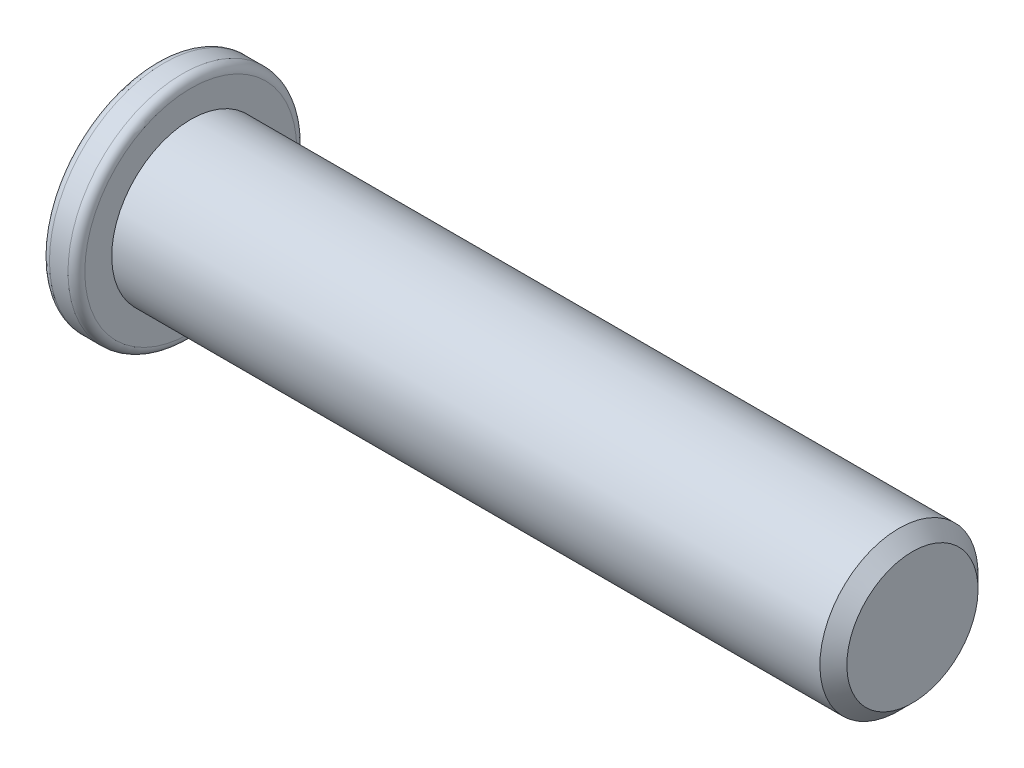
ISO-10303-21;
HEADER;
FILE_DESCRIPTION(('STEP AP214'),'2;1');
FILE_NAME('part.step','',(''),(''),'','','');
FILE_SCHEMA(('AUTOMOTIVE_DESIGN { 1 0 10303 214 1 1 1 1 }'));
ENDSEC;
DATA;
#1=APPLICATION_CONTEXT('core data for automotive mechanical design processes');
#2=APPLICATION_PROTOCOL_DEFINITION('international standard','automotive_design',2000,#1);
#3=PRODUCT_CONTEXT('',#1,'mechanical');
#4=PRODUCT('Part','Part','',(#3));
#5=PRODUCT_RELATED_PRODUCT_CATEGORY('part','',(#4));
#6=PRODUCT_DEFINITION_FORMATION('','',#4);
#7=PRODUCT_DEFINITION_CONTEXT('part definition',#1,'design');
#8=PRODUCT_DEFINITION('design','',#6,#7);
#9=PRODUCT_DEFINITION_SHAPE('','',#8);
#10=(LENGTH_UNIT() NAMED_UNIT(*) SI_UNIT(.MILLI.,.METRE.));
#11=(NAMED_UNIT(*) PLANE_ANGLE_UNIT() SI_UNIT($,.RADIAN.));
#12=(NAMED_UNIT(*) SI_UNIT($,.STERADIAN.) SOLID_ANGLE_UNIT());
#13=UNCERTAINTY_MEASURE_WITH_UNIT(LENGTH_MEASURE(1.E-05),#10,'distance_accuracy_value','');
#14=(GEOMETRIC_REPRESENTATION_CONTEXT(3) GLOBAL_UNCERTAINTY_ASSIGNED_CONTEXT((#13)) GLOBAL_UNIT_ASSIGNED_CONTEXT((#10,
#11,#12)) REPRESENTATION_CONTEXT('',''));
#15=CARTESIAN_POINT('',(0.,0.,0.));
#16=DIRECTION('',(0.,0.,1.));
#17=DIRECTION('',(1.,0.,0.));
#18=AXIS2_PLACEMENT_3D('',#15,#16,#17);
#19=CARTESIAN_POINT('',(0.,0.,0.));
#20=DIRECTION('',(-1.,0.,0.));
#21=DIRECTION('',(0.,-1.,0.));
#22=AXIS2_PLACEMENT_3D('',#19,#20,#21);
#23=PLANE('',#22);
#24=CARTESIAN_POINT('',(0.,0.,0.));
#25=DIRECTION('',(-1.,0.,0.));
#26=DIRECTION('',(0.,-1.,0.));
#27=AXIS2_PLACEMENT_3D('',#24,#25,#26);
#28=CIRCLE('',#27,6.3);
#29=CARTESIAN_POINT('',(0.,-6.3,0.));
#30=VERTEX_POINT('',#29);
#31=EDGE_CURVE('E48',#30,#30,#28,.T.);
#32=ORIENTED_EDGE('',*,*,#31,.T.);
#33=EDGE_LOOP('',(#32));
#34=FACE_BOUND('',#33,.T.);
#35=ADVANCED_FACE('F37',(#34),#23,.T.);
#36=CARTESIAN_POINT('',(45.,0.,0.));
#37=DIRECTION('',(1.,0.,0.));
#38=DIRECTION('',(0.,1.,0.));
#39=AXIS2_PLACEMENT_3D('',#36,#37,#38);
#40=CYLINDRICAL_SURFACE('',#39,6.8);
#41=CARTESIAN_POINT('',(1.6,0.,0.));
#42=DIRECTION('',(1.,0.,0.));
#43=DIRECTION('',(0.,1.,0.));
#44=AXIS2_PLACEMENT_3D('',#41,#42,#43);
#45=CIRCLE('',#44,6.8);
#46=CARTESIAN_POINT('',(1.60000000000001,6.8,0.));
#47=VERTEX_POINT('',#46);
#48=EDGE_CURVE('E52',#47,#47,#45,.F.);
#49=ORIENTED_EDGE('',*,*,#48,.T.);
#50=EDGE_LOOP('',(#49));
#51=FACE_BOUND('',#50,.T.);
#52=CARTESIAN_POINT('',(0.5,0.,0.));
#53=DIRECTION('',(-1.,0.,0.));
#54=DIRECTION('',(0.,-1.,0.));
#55=AXIS2_PLACEMENT_3D('',#52,#53,#54);
#56=CIRCLE('',#55,6.8);
#57=CARTESIAN_POINT('',(0.499999999999998,-6.8,0.));
#58=VERTEX_POINT('',#57);
#59=EDGE_CURVE('E57',#58,#58,#56,.F.);
#60=ORIENTED_EDGE('',*,*,#59,.T.);
#61=EDGE_LOOP('',(#60));
#62=FACE_BOUND('',#61,.T.);
#63=ADVANCED_FACE('F71',(#51,#62),#40,.T.);
#64=CARTESIAN_POINT('',(2.1,6.8,0.));
#65=DIRECTION('',(1.,0.,0.));
#66=DIRECTION('',(0.,1.,0.));
#67=AXIS2_PLACEMENT_3D('',#64,#65,#66);
#68=PLANE('',#67);
#69=CARTESIAN_POINT('',(2.1,0.,0.));
#70=DIRECTION('',(1.,0.,0.));
#71=DIRECTION('',(0.,1.,0.));
#72=AXIS2_PLACEMENT_3D('',#69,#70,#71);
#73=CIRCLE('',#72,6.3);
#74=CARTESIAN_POINT('',(2.1,6.3,0.));
#75=VERTEX_POINT('',#74);
#76=EDGE_CURVE('E60',#75,#75,#73,.T.);
#77=ORIENTED_EDGE('',*,*,#76,.T.);
#78=EDGE_LOOP('',(#77));
#79=FACE_BOUND('',#78,.T.);
#80=CARTESIAN_POINT('',(2.1,0.,0.));
#81=DIRECTION('',(1.,0.,0.));
#82=DIRECTION('',(0.,1.,0.));
#83=AXIS2_PLACEMENT_3D('',#80,#81,#82);
#84=CIRCLE('',#83,4.7);
#85=CARTESIAN_POINT('',(2.10000000000001,4.7,0.));
#86=VERTEX_POINT('',#85);
#87=EDGE_CURVE('E63',#86,#86,#84,.T.);
#88=ORIENTED_EDGE('',*,*,#87,.F.);
#89=EDGE_LOOP('',(#88));
#90=FACE_BOUND('',#89,.T.);
#91=ADVANCED_FACE('F69',(#79,#90),#68,.T.);
#92=CARTESIAN_POINT('',(45.,0.,0.));
#93=DIRECTION('',(1.,0.,0.));
#94=DIRECTION('',(0.,1.,0.));
#95=AXIS2_PLACEMENT_3D('',#92,#93,#94);
#96=CYLINDRICAL_SURFACE('',#95,4.70000000000001);
#97=CARTESIAN_POINT('',(44.2,0.,0.));
#98=DIRECTION('',(1.,0.,0.));
#99=DIRECTION('',(0.,1.,0.));
#100=AXIS2_PLACEMENT_3D('',#97,#98,#99);
#101=CIRCLE('',#100,4.70000000000001);
#102=CARTESIAN_POINT('',(44.2,4.69999999999999,0.));
#103=VERTEX_POINT('',#102);
#104=EDGE_CURVE('E10',#103,#103,#101,.F.);
#105=ORIENTED_EDGE('',*,*,#104,.T.);
#106=EDGE_LOOP('',(#105));
#107=FACE_BOUND('',#106,.T.);
#108=ORIENTED_EDGE('',*,*,#87,.T.);
#109=EDGE_LOOP('',(#108));
#110=FACE_BOUND('',#109,.T.);
#111=ADVANCED_FACE('F67',(#107,#110),#96,.T.);
#112=CARTESIAN_POINT('',(45.,4.7,0.));
#113=DIRECTION('',(1.,0.,0.));
#114=DIRECTION('',(0.,1.,0.));
#115=AXIS2_PLACEMENT_3D('',#112,#113,#114);
#116=PLANE('',#115);
#117=CARTESIAN_POINT('',(45.,0.,0.));
#118=DIRECTION('',(1.,0.,0.));
#119=DIRECTION('',(0.,1.,0.));
#120=AXIS2_PLACEMENT_3D('',#117,#118,#119);
#121=CIRCLE('',#120,3.90000000000002);
#122=CARTESIAN_POINT('',(45.,3.90000000000001,0.));
#123=VERTEX_POINT('',#122);
#124=EDGE_CURVE('E44',#123,#123,#121,.T.);
#125=ORIENTED_EDGE('',*,*,#124,.T.);
#126=EDGE_LOOP('',(#125));
#127=FACE_BOUND('',#126,.T.);
#128=ADVANCED_FACE('F78',(#127),#116,.T.);
#129=CARTESIAN_POINT('',(1.6,0.,0.));
#130=DIRECTION('',(1.,0.,0.));
#131=DIRECTION('',(0.,1.,0.));
#132=AXIS2_PLACEMENT_3D('',#129,#130,#131);
#133=TOROIDAL_SURFACE('',#132,6.3,0.5);
#134=ORIENTED_EDGE('',*,*,#48,.F.);
#135=EDGE_LOOP('',(#134));
#136=FACE_BOUND('',#135,.T.);
#137=ORIENTED_EDGE('',*,*,#76,.F.);
#138=EDGE_LOOP('',(#137));
#139=FACE_BOUND('',#138,.T.);
#140=ADVANCED_FACE('F88',(#136,#139),#133,.T.);
#141=CARTESIAN_POINT('',(0.5,0.,0.));
#142=DIRECTION('',(-1.,0.,0.));
#143=DIRECTION('',(0.,-1.,0.));
#144=AXIS2_PLACEMENT_3D('',#141,#142,#143);
#145=TOROIDAL_SURFACE('',#144,6.3,0.5);
#146=ORIENTED_EDGE('',*,*,#31,.F.);
#147=EDGE_LOOP('',(#146));
#148=FACE_BOUND('',#147,.T.);
#149=ORIENTED_EDGE('',*,*,#59,.F.);
#150=EDGE_LOOP('',(#149));
#151=FACE_BOUND('',#150,.T.);
#152=ADVANCED_FACE('F90',(#148,#151),#145,.T.);
#153=CARTESIAN_POINT('',(45.,0.,0.));
#154=DIRECTION('',(-1.,0.,0.));
#155=DIRECTION('',(0.,-1.,0.));
#156=AXIS2_PLACEMENT_3D('',#153,#154,#155);
#157=CONICAL_SURFACE('',#156,3.90000000000002,0.785398163397446);
#158=ORIENTED_EDGE('',*,*,#104,.F.);
#159=EDGE_LOOP('',(#158));
#160=FACE_BOUND('',#159,.T.);
#161=ORIENTED_EDGE('',*,*,#124,.F.);
#162=EDGE_LOOP('',(#161));
#163=FACE_BOUND('',#162,.T.);
#164=ADVANCED_FACE('F39',(#160,#163),#157,.T.);
#165=CLOSED_SHELL('',(#35,#63,#91,#111,#128,#140,#152,#164));
#166=MANIFOLD_SOLID_BREP('B2',#165);
#167=ADVANCED_BREP_SHAPE_REPRESENTATION('',(#18,#166),#14);
#168=SHAPE_DEFINITION_REPRESENTATION(#9,#167);
ENDSEC;
END-ISO-10303-21;
